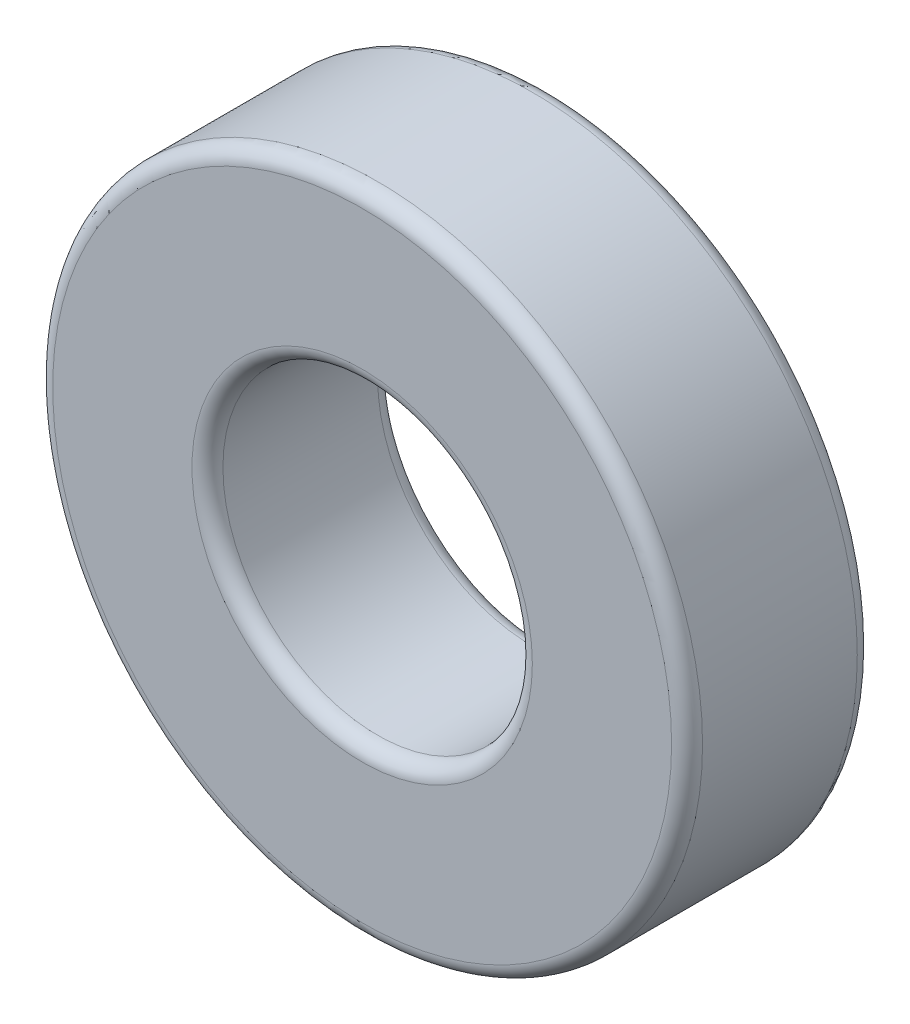
ISO-10303-21;
HEADER;
FILE_DESCRIPTION(('STEP AP214'),'2;1');
FILE_NAME('part.step','',(''),(''),'','','');
FILE_SCHEMA(('AUTOMOTIVE_DESIGN { 1 0 10303 214 1 1 1 1 }'));
ENDSEC;
DATA;
#1=APPLICATION_CONTEXT('core data for automotive mechanical design processes');
#2=APPLICATION_PROTOCOL_DEFINITION('international standard','automotive_design',2000,#1);
#3=PRODUCT_CONTEXT('',#1,'mechanical');
#4=PRODUCT('Part','Part','',(#3));
#5=PRODUCT_RELATED_PRODUCT_CATEGORY('part','',(#4));
#6=PRODUCT_DEFINITION_FORMATION('','',#4);
#7=PRODUCT_DEFINITION_CONTEXT('part definition',#1,'design');
#8=PRODUCT_DEFINITION('design','',#6,#7);
#9=PRODUCT_DEFINITION_SHAPE('','',#8);
#10=(LENGTH_UNIT() NAMED_UNIT(*) SI_UNIT(.MILLI.,.METRE.));
#11=(NAMED_UNIT(*) PLANE_ANGLE_UNIT() SI_UNIT($,.RADIAN.));
#12=(NAMED_UNIT(*) SI_UNIT($,.STERADIAN.) SOLID_ANGLE_UNIT());
#13=UNCERTAINTY_MEASURE_WITH_UNIT(LENGTH_MEASURE(1.E-05),#10,'distance_accuracy_value','');
#14=(GEOMETRIC_REPRESENTATION_CONTEXT(3) GLOBAL_UNCERTAINTY_ASSIGNED_CONTEXT((#13)) GLOBAL_UNIT_ASSIGNED_CONTEXT((#10,
#11,#12)) REPRESENTATION_CONTEXT('',''));
#15=CARTESIAN_POINT('',(0.,0.,0.));
#16=DIRECTION('',(0.,0.,1.));
#17=DIRECTION('',(1.,0.,0.));
#18=AXIS2_PLACEMENT_3D('',#15,#16,#17);
#19=CARTESIAN_POINT('',(0.,0.,6.));
#20=DIRECTION('',(0.,0.,1.));
#21=DIRECTION('',(1.,0.,0.));
#22=AXIS2_PLACEMENT_3D('',#19,#20,#21);
#23=PLANE('',#22);
#24=CARTESIAN_POINT('',(0.,0.,6.));
#25=DIRECTION('',(0.,0.,1.));
#26=DIRECTION('',(1.,0.,0.));
#27=AXIS2_PLACEMENT_3D('',#24,#25,#26);
#28=CIRCLE('',#27,11.);
#29=CARTESIAN_POINT('',(11.,0.,6.));
#30=VERTEX_POINT('',#29);
#31=EDGE_CURVE('E50',#30,#30,#28,.F.);
#32=ORIENTED_EDGE('',*,*,#31,.T.);
#33=EDGE_LOOP('',(#32));
#34=FACE_BOUND('',#33,.T.);
#35=CARTESIAN_POINT('',(0.,0.,6.));
#36=DIRECTION('',(0.,0.,1.));
#37=DIRECTION('',(1.,0.,0.));
#38=AXIS2_PLACEMENT_3D('',#35,#36,#37);
#39=CIRCLE('',#38,20.);
#40=CARTESIAN_POINT('',(20.,0.,6.));
#41=VERTEX_POINT('',#40);
#42=EDGE_CURVE('E55',#41,#41,#39,.T.);
#43=ORIENTED_EDGE('',*,*,#42,.T.);
#44=EDGE_LOOP('',(#43));
#45=FACE_BOUND('',#44,.T.);
#46=ADVANCED_FACE('F37',(#34,#45),#23,.T.);
#47=CARTESIAN_POINT('',(0.,0.,-6.));
#48=DIRECTION('',(0.,0.,1.));
#49=DIRECTION('',(1.,0.,0.));
#50=AXIS2_PLACEMENT_3D('',#47,#48,#49);
#51=PLANE('',#50);
#52=CARTESIAN_POINT('',(0.,0.,-6.));
#53=DIRECTION('',(0.,0.,1.));
#54=DIRECTION('',(1.,0.,0.));
#55=AXIS2_PLACEMENT_3D('',#52,#53,#54);
#56=CIRCLE('',#55,11.);
#57=CARTESIAN_POINT('',(11.,0.,-6.));
#58=VERTEX_POINT('',#57);
#59=EDGE_CURVE('E69',#58,#58,#56,.T.);
#60=ORIENTED_EDGE('',*,*,#59,.T.);
#61=EDGE_LOOP('',(#60));
#62=FACE_BOUND('',#61,.T.);
#63=CARTESIAN_POINT('',(0.,0.,-6.));
#64=DIRECTION('',(0.,0.,1.));
#65=DIRECTION('',(1.,0.,0.));
#66=AXIS2_PLACEMENT_3D('',#63,#64,#65);
#67=CIRCLE('',#66,20.);
#68=CARTESIAN_POINT('',(20.,0.,-6.));
#69=VERTEX_POINT('',#68);
#70=EDGE_CURVE('E73',#69,#69,#67,.F.);
#71=ORIENTED_EDGE('',*,*,#70,.T.);
#72=EDGE_LOOP('',(#71));
#73=FACE_BOUND('',#72,.T.);
#74=ADVANCED_FACE('F78',(#62,#73),#51,.F.);
#75=CARTESIAN_POINT('',(0.,0.,6.));
#76=DIRECTION('',(0.,0.,-1.));
#77=DIRECTION('',(-1.,0.,0.));
#78=AXIS2_PLACEMENT_3D('',#75,#76,#77);
#79=CYLINDRICAL_SURFACE('',#78,21.);
#80=CARTESIAN_POINT('',(0.,0.,-5.));
#81=DIRECTION('',(0.,0.,1.));
#82=DIRECTION('',(1.,0.,0.));
#83=AXIS2_PLACEMENT_3D('',#80,#81,#82);
#84=CIRCLE('',#83,21.);
#85=CARTESIAN_POINT('',(21.,0.,-5.));
#86=VERTEX_POINT('',#85);
#87=EDGE_CURVE('E10',#86,#86,#84,.T.);
#88=ORIENTED_EDGE('',*,*,#87,.T.);
#89=EDGE_LOOP('',(#88));
#90=FACE_BOUND('',#89,.T.);
#91=CARTESIAN_POINT('',(0.,0.,5.));
#92=DIRECTION('',(0.,0.,1.));
#93=DIRECTION('',(1.,0.,0.));
#94=AXIS2_PLACEMENT_3D('',#91,#92,#93);
#95=CIRCLE('',#94,21.);
#96=CARTESIAN_POINT('',(21.,0.,5.));
#97=VERTEX_POINT('',#96);
#98=EDGE_CURVE('E45',#97,#97,#95,.F.);
#99=ORIENTED_EDGE('',*,*,#98,.T.);
#100=EDGE_LOOP('',(#99));
#101=FACE_BOUND('',#100,.T.);
#102=ADVANCED_FACE('F98',(#90,#101),#79,.T.);
#103=CARTESIAN_POINT('',(0.,0.,6.));
#104=DIRECTION('',(0.,0.,-1.));
#105=DIRECTION('',(-1.,0.,0.));
#106=AXIS2_PLACEMENT_3D('',#103,#104,#105);
#107=CYLINDRICAL_SURFACE('',#106,10.);
#108=CARTESIAN_POINT('',(0.,0.,-5.));
#109=DIRECTION('',(0.,0.,1.));
#110=DIRECTION('',(1.,0.,0.));
#111=AXIS2_PLACEMENT_3D('',#108,#109,#110);
#112=CIRCLE('',#111,10.);
#113=CARTESIAN_POINT('',(10.,0.,-5.));
#114=VERTEX_POINT('',#113);
#115=EDGE_CURVE('E61',#114,#114,#112,.F.);
#116=ORIENTED_EDGE('',*,*,#115,.T.);
#117=EDGE_LOOP('',(#116));
#118=FACE_BOUND('',#117,.T.);
#119=CARTESIAN_POINT('',(0.,0.,5.));
#120=DIRECTION('',(0.,0.,1.));
#121=DIRECTION('',(1.,0.,0.));
#122=AXIS2_PLACEMENT_3D('',#119,#120,#121);
#123=CIRCLE('',#122,10.);
#124=CARTESIAN_POINT('',(10.,0.,5.));
#125=VERTEX_POINT('',#124);
#126=EDGE_CURVE('E65',#125,#125,#123,.T.);
#127=ORIENTED_EDGE('',*,*,#126,.T.);
#128=EDGE_LOOP('',(#127));
#129=FACE_BOUND('',#128,.T.);
#130=ADVANCED_FACE('F103',(#118,#129),#107,.F.);
#131=CARTESIAN_POINT('',(0.,0.,-5.));
#132=DIRECTION('',(0.,0.,1.));
#133=DIRECTION('',(1.,0.,0.));
#134=AXIS2_PLACEMENT_3D('',#131,#132,#133);
#135=TOROIDAL_SURFACE('',#134,11.,1.);
#136=ORIENTED_EDGE('',*,*,#115,.F.);
#137=EDGE_LOOP('',(#136));
#138=FACE_BOUND('',#137,.T.);
#139=ORIENTED_EDGE('',*,*,#59,.F.);
#140=EDGE_LOOP('',(#139));
#141=FACE_BOUND('',#140,.T.);
#142=ADVANCED_FACE('F89',(#138,#141),#135,.T.);
#143=CARTESIAN_POINT('',(0.,0.,5.));
#144=DIRECTION('',(0.,0.,1.));
#145=DIRECTION('',(1.,0.,0.));
#146=AXIS2_PLACEMENT_3D('',#143,#144,#145);
#147=TOROIDAL_SURFACE('',#146,11.,1.);
#148=ORIENTED_EDGE('',*,*,#31,.F.);
#149=EDGE_LOOP('',(#148));
#150=FACE_BOUND('',#149,.T.);
#151=ORIENTED_EDGE('',*,*,#126,.F.);
#152=EDGE_LOOP('',(#151));
#153=FACE_BOUND('',#152,.T.);
#154=ADVANCED_FACE('F83',(#150,#153),#147,.T.);
#155=CARTESIAN_POINT('',(0.,0.,-5.));
#156=DIRECTION('',(0.,0.,1.));
#157=DIRECTION('',(1.,0.,0.));
#158=AXIS2_PLACEMENT_3D('',#155,#156,#157);
#159=TOROIDAL_SURFACE('',#158,20.,1.);
#160=ORIENTED_EDGE('',*,*,#70,.F.);
#161=EDGE_LOOP('',(#160));
#162=FACE_BOUND('',#161,.T.);
#163=ORIENTED_EDGE('',*,*,#87,.F.);
#164=EDGE_LOOP('',(#163));
#165=FACE_BOUND('',#164,.T.);
#166=ADVANCED_FACE('F80',(#162,#165),#159,.T.);
#167=CARTESIAN_POINT('',(0.,0.,5.));
#168=DIRECTION('',(0.,0.,1.));
#169=DIRECTION('',(1.,0.,0.));
#170=AXIS2_PLACEMENT_3D('',#167,#168,#169);
#171=TOROIDAL_SURFACE('',#170,20.,1.);
#172=ORIENTED_EDGE('',*,*,#98,.F.);
#173=EDGE_LOOP('',(#172));
#174=FACE_BOUND('',#173,.T.);
#175=ORIENTED_EDGE('',*,*,#42,.F.);
#176=EDGE_LOOP('',(#175));
#177=FACE_BOUND('',#176,.T.);
#178=ADVANCED_FACE('F39',(#174,#177),#171,.T.);
#179=CLOSED_SHELL('',(#46,#74,#102,#130,#142,#154,#166,#178));
#180=MANIFOLD_SOLID_BREP('B2',#179);
#181=ADVANCED_BREP_SHAPE_REPRESENTATION('',(#18,#180),#14);
#182=SHAPE_DEFINITION_REPRESENTATION(#9,#181);
ENDSEC;
END-ISO-10303-21;
